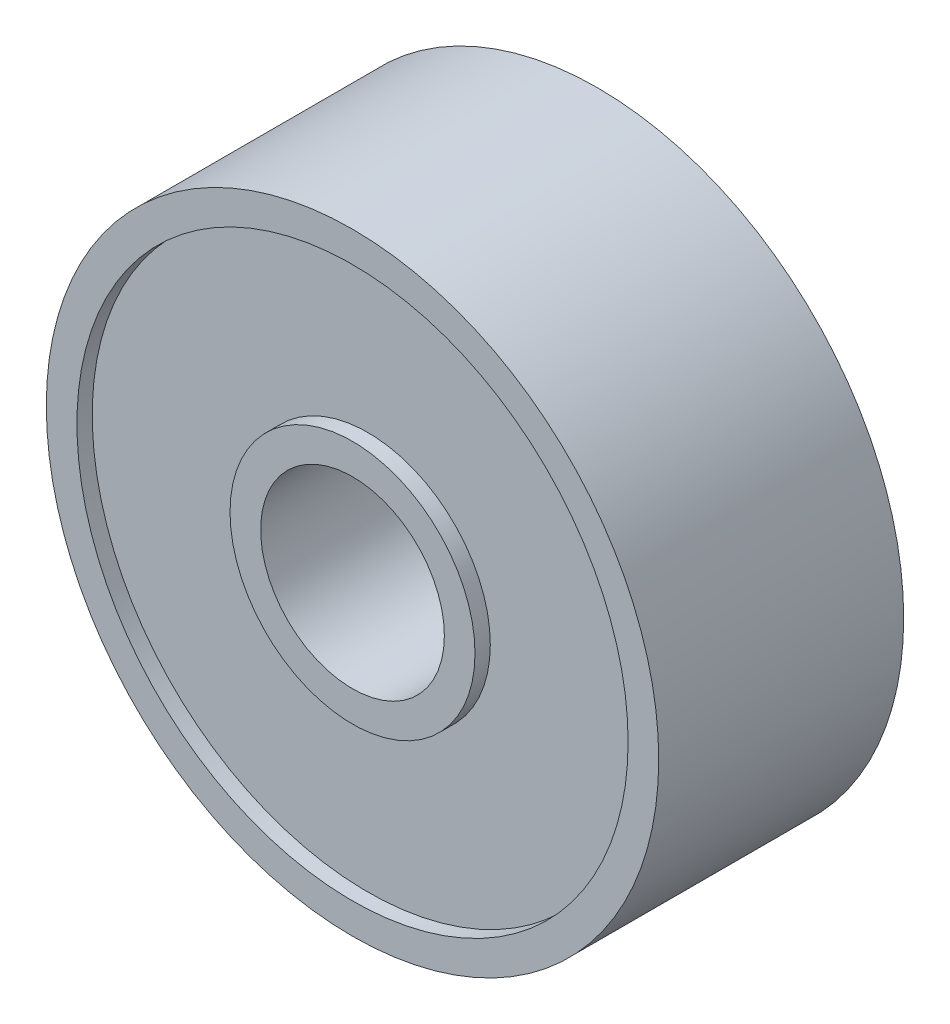
ISO-10303-21;
HEADER;
FILE_DESCRIPTION(('STEP AP214'),'2;1');
FILE_NAME('part.step','',(''),(''),'','','');
FILE_SCHEMA(('AUTOMOTIVE_DESIGN { 1 0 10303 214 1 1 1 1 }'));
ENDSEC;
DATA;
#1=APPLICATION_CONTEXT('core data for automotive mechanical design processes');
#2=APPLICATION_PROTOCOL_DEFINITION('international standard','automotive_design',2000,#1);
#3=PRODUCT_CONTEXT('',#1,'mechanical');
#4=PRODUCT('Part','Part','',(#3));
#5=PRODUCT_RELATED_PRODUCT_CATEGORY('part','',(#4));
#6=PRODUCT_DEFINITION_FORMATION('','',#4);
#7=PRODUCT_DEFINITION_CONTEXT('part definition',#1,'design');
#8=PRODUCT_DEFINITION('design','',#6,#7);
#9=PRODUCT_DEFINITION_SHAPE('','',#8);
#10=(LENGTH_UNIT() NAMED_UNIT(*) SI_UNIT(.MILLI.,.METRE.));
#11=(NAMED_UNIT(*) PLANE_ANGLE_UNIT() SI_UNIT($,.RADIAN.));
#12=(NAMED_UNIT(*) SI_UNIT($,.STERADIAN.) SOLID_ANGLE_UNIT());
#13=UNCERTAINTY_MEASURE_WITH_UNIT(LENGTH_MEASURE(1.E-05),#10,'distance_accuracy_value','');
#14=(GEOMETRIC_REPRESENTATION_CONTEXT(3) GLOBAL_UNCERTAINTY_ASSIGNED_CONTEXT((#13)) GLOBAL_UNIT_ASSIGNED_CONTEXT((#10,
#11,#12)) REPRESENTATION_CONTEXT('',''));
#15=CARTESIAN_POINT('',(0.,0.,0.));
#16=DIRECTION('',(0.,0.,1.));
#17=DIRECTION('',(1.,0.,0.));
#18=AXIS2_PLACEMENT_3D('',#15,#16,#17);
#19=CARTESIAN_POINT('',(0.,0.,-2.));
#20=DIRECTION('',(0.,0.,1.));
#21=DIRECTION('',(1.,0.,0.));
#22=AXIS2_PLACEMENT_3D('',#19,#20,#21);
#23=PLANE('',#22);
#24=CARTESIAN_POINT('',(0.,0.,-2.));
#25=DIRECTION('',(0.,0.,1.));
#26=DIRECTION('',(1.,0.,0.));
#27=AXIS2_PLACEMENT_3D('',#24,#25,#26);
#28=CIRCLE('',#27,1.5);
#29=CARTESIAN_POINT('',(1.5,0.,-2.));
#30=VERTEX_POINT('',#29);
#31=EDGE_CURVE('E60',#30,#30,#28,.T.);
#32=ORIENTED_EDGE('',*,*,#31,.T.);
#33=EDGE_LOOP('',(#32));
#34=FACE_BOUND('',#33,.T.);
#35=CARTESIAN_POINT('',(0.,0.,-2.));
#36=DIRECTION('',(0.,0.,1.));
#37=DIRECTION('',(1.,0.,0.));
#38=AXIS2_PLACEMENT_3D('',#35,#36,#37);
#39=CIRCLE('',#38,2.);
#40=CARTESIAN_POINT('',(2.,0.,-2.));
#41=VERTEX_POINT('',#40);
#42=EDGE_CURVE('E84',#41,#41,#39,.T.);
#43=ORIENTED_EDGE('',*,*,#42,.F.);
#44=EDGE_LOOP('',(#43));
#45=FACE_BOUND('',#44,.T.);
#46=ADVANCED_FACE('F47',(#34,#45),#23,.F.);
#47=CARTESIAN_POINT('',(0.,0.,2.));
#48=DIRECTION('',(0.,0.,1.));
#49=DIRECTION('',(1.,0.,0.));
#50=AXIS2_PLACEMENT_3D('',#47,#48,#49);
#51=PLANE('',#50);
#52=CARTESIAN_POINT('',(0.,0.,2.));
#53=DIRECTION('',(0.,0.,1.));
#54=DIRECTION('',(1.,0.,0.));
#55=AXIS2_PLACEMENT_3D('',#52,#53,#54);
#56=CIRCLE('',#55,1.5);
#57=CARTESIAN_POINT('',(1.5,0.,2.));
#58=VERTEX_POINT('',#57);
#59=EDGE_CURVE('E58',#58,#58,#56,.T.);
#60=ORIENTED_EDGE('',*,*,#59,.F.);
#61=EDGE_LOOP('',(#60));
#62=FACE_BOUND('',#61,.T.);
#63=CARTESIAN_POINT('',(0.,0.,2.));
#64=DIRECTION('',(0.,0.,1.));
#65=DIRECTION('',(1.,0.,0.));
#66=AXIS2_PLACEMENT_3D('',#63,#64,#65);
#67=CIRCLE('',#66,2.);
#68=CARTESIAN_POINT('',(2.,0.,2.));
#69=VERTEX_POINT('',#68);
#70=EDGE_CURVE('E72',#69,#69,#67,.T.);
#71=ORIENTED_EDGE('',*,*,#70,.T.);
#72=EDGE_LOOP('',(#71));
#73=FACE_BOUND('',#72,.T.);
#74=ADVANCED_FACE('F100',(#62,#73),#51,.T.);
#75=CARTESIAN_POINT('',(0.,0.,2.));
#76=DIRECTION('',(0.,0.,1.));
#77=DIRECTION('',(1.,0.,0.));
#78=AXIS2_PLACEMENT_3D('',#75,#76,#77);
#79=CIRCLE('',#78,4.5);
#80=CARTESIAN_POINT('',(4.5,0.,2.));
#81=VERTEX_POINT('',#80);
#82=EDGE_CURVE('E66',#81,#81,#79,.T.);
#83=ORIENTED_EDGE('',*,*,#82,.F.);
#84=EDGE_LOOP('',(#83));
#85=FACE_BOUND('',#84,.T.);
#86=CARTESIAN_POINT('',(0.,0.,2.));
#87=DIRECTION('',(0.,0.,1.));
#88=DIRECTION('',(1.,0.,0.));
#89=AXIS2_PLACEMENT_3D('',#86,#87,#88);
#90=CIRCLE('',#89,5.);
#91=CARTESIAN_POINT('',(5.,0.,2.));
#92=VERTEX_POINT('',#91);
#93=EDGE_CURVE('E11',#92,#92,#90,.T.);
#94=ORIENTED_EDGE('',*,*,#93,.T.);
#95=EDGE_LOOP('',(#94));
#96=FACE_BOUND('',#95,.T.);
#97=ADVANCED_FACE('F106',(#85,#96),#51,.T.);
#98=CARTESIAN_POINT('',(0.,0.,-2.));
#99=DIRECTION('',(0.,0.,1.));
#100=DIRECTION('',(1.,0.,0.));
#101=AXIS2_PLACEMENT_3D('',#98,#99,#100);
#102=CIRCLE('',#101,4.5);
#103=CARTESIAN_POINT('',(4.5,0.,-2.));
#104=VERTEX_POINT('',#103);
#105=EDGE_CURVE('E78',#104,#104,#102,.T.);
#106=ORIENTED_EDGE('',*,*,#105,.T.);
#107=EDGE_LOOP('',(#106));
#108=FACE_BOUND('',#107,.T.);
#109=CARTESIAN_POINT('',(0.,0.,-2.));
#110=DIRECTION('',(0.,0.,1.));
#111=DIRECTION('',(1.,0.,0.));
#112=AXIS2_PLACEMENT_3D('',#109,#110,#111);
#113=CIRCLE('',#112,5.);
#114=CARTESIAN_POINT('',(5.,0.,-2.));
#115=VERTEX_POINT('',#114);
#116=EDGE_CURVE('E51',#115,#115,#113,.T.);
#117=ORIENTED_EDGE('',*,*,#116,.F.);
#118=EDGE_LOOP('',(#117));
#119=FACE_BOUND('',#118,.T.);
#120=ADVANCED_FACE('F102',(#108,#119),#23,.F.);
#121=CARTESIAN_POINT('',(0.,0.,2.));
#122=DIRECTION('',(0.,0.,-1.));
#123=DIRECTION('',(-1.,0.,0.));
#124=AXIS2_PLACEMENT_3D('',#121,#122,#123);
#125=CYLINDRICAL_SURFACE('',#124,5.);
#126=ORIENTED_EDGE('',*,*,#93,.F.);
#127=EDGE_LOOP('',(#126));
#128=FACE_BOUND('',#127,.T.);
#129=ORIENTED_EDGE('',*,*,#116,.T.);
#130=EDGE_LOOP('',(#129));
#131=FACE_BOUND('',#130,.T.);
#132=ADVANCED_FACE('F49',(#128,#131),#125,.T.);
#133=CARTESIAN_POINT('',(0.,0.,2.));
#134=DIRECTION('',(0.,0.,-1.));
#135=DIRECTION('',(-1.,0.,0.));
#136=AXIS2_PLACEMENT_3D('',#133,#134,#135);
#137=CYLINDRICAL_SURFACE('',#136,1.5);
#138=ORIENTED_EDGE('',*,*,#59,.T.);
#139=EDGE_LOOP('',(#138));
#140=FACE_BOUND('',#139,.T.);
#141=ORIENTED_EDGE('',*,*,#31,.F.);
#142=EDGE_LOOP('',(#141));
#143=FACE_BOUND('',#142,.T.);
#144=ADVANCED_FACE('F115',(#140,#143),#137,.F.);
#145=CARTESIAN_POINT('',(0.,0.,1.75));
#146=DIRECTION('',(0.,0.,1.));
#147=DIRECTION('',(1.,0.,0.));
#148=AXIS2_PLACEMENT_3D('',#145,#146,#147);
#149=CYLINDRICAL_SURFACE('',#148,4.5);
#150=CARTESIAN_POINT('',(0.,0.,1.75));
#151=DIRECTION('',(0.,0.,1.));
#152=DIRECTION('',(1.,0.,0.));
#153=AXIS2_PLACEMENT_3D('',#150,#151,#152);
#154=CIRCLE('',#153,4.5);
#155=CARTESIAN_POINT('',(4.5,0.,1.75));
#156=VERTEX_POINT('',#155);
#157=EDGE_CURVE('E63',#156,#156,#154,.T.);
#158=ORIENTED_EDGE('',*,*,#157,.F.);
#159=EDGE_LOOP('',(#158));
#160=FACE_BOUND('',#159,.T.);
#161=ORIENTED_EDGE('',*,*,#82,.T.);
#162=EDGE_LOOP('',(#161));
#163=FACE_BOUND('',#162,.T.);
#164=ADVANCED_FACE('F139',(#160,#163),#149,.F.);
#165=CARTESIAN_POINT('',(0.,0.,1.75));
#166=DIRECTION('',(0.,0.,1.));
#167=DIRECTION('',(1.,0.,0.));
#168=AXIS2_PLACEMENT_3D('',#165,#166,#167);
#169=PLANE('',#168);
#170=CARTESIAN_POINT('',(0.,0.,1.75));
#171=DIRECTION('',(0.,0.,1.));
#172=DIRECTION('',(1.,0.,0.));
#173=AXIS2_PLACEMENT_3D('',#170,#171,#172);
#174=CIRCLE('',#173,2.);
#175=CARTESIAN_POINT('',(2.,0.,1.75));
#176=VERTEX_POINT('',#175);
#177=EDGE_CURVE('E69',#176,#176,#174,.T.);
#178=ORIENTED_EDGE('',*,*,#177,.F.);
#179=EDGE_LOOP('',(#178));
#180=FACE_BOUND('',#179,.T.);
#181=ORIENTED_EDGE('',*,*,#157,.T.);
#182=EDGE_LOOP('',(#181));
#183=FACE_BOUND('',#182,.T.);
#184=ADVANCED_FACE('F135',(#180,#183),#169,.T.);
#185=CARTESIAN_POINT('',(0.,0.,1.75));
#186=DIRECTION('',(0.,0.,1.));
#187=DIRECTION('',(1.,0.,0.));
#188=AXIS2_PLACEMENT_3D('',#185,#186,#187);
#189=CYLINDRICAL_SURFACE('',#188,2.);
#190=ORIENTED_EDGE('',*,*,#177,.T.);
#191=EDGE_LOOP('',(#190));
#192=FACE_BOUND('',#191,.T.);
#193=ORIENTED_EDGE('',*,*,#70,.F.);
#194=EDGE_LOOP('',(#193));
#195=FACE_BOUND('',#194,.T.);
#196=ADVANCED_FACE('F129',(#192,#195),#189,.T.);
#197=CARTESIAN_POINT('',(0.,0.,-1.75));
#198=DIRECTION('',(0.,0.,-1.));
#199=DIRECTION('',(1.,0.,0.));
#200=AXIS2_PLACEMENT_3D('',#197,#198,#199);
#201=PLANE('',#200);
#202=CARTESIAN_POINT('',(0.,0.,-1.75));
#203=DIRECTION('',(0.,0.,1.));
#204=DIRECTION('',(1.,0.,0.));
#205=AXIS2_PLACEMENT_3D('',#202,#203,#204);
#206=CIRCLE('',#205,4.5);
#207=CARTESIAN_POINT('',(4.5,0.,-1.75));
#208=VERTEX_POINT('',#207);
#209=EDGE_CURVE('E75',#208,#208,#206,.T.);
#210=ORIENTED_EDGE('',*,*,#209,.F.);
#211=EDGE_LOOP('',(#210));
#212=FACE_BOUND('',#211,.T.);
#213=CARTESIAN_POINT('',(0.,0.,-1.75));
#214=DIRECTION('',(0.,0.,1.));
#215=DIRECTION('',(1.,0.,0.));
#216=AXIS2_PLACEMENT_3D('',#213,#214,#215);
#217=CIRCLE('',#216,2.);
#218=CARTESIAN_POINT('',(2.,0.,-1.75));
#219=VERTEX_POINT('',#218);
#220=EDGE_CURVE('E81',#219,#219,#217,.T.);
#221=ORIENTED_EDGE('',*,*,#220,.T.);
#222=EDGE_LOOP('',(#221));
#223=FACE_BOUND('',#222,.T.);
#224=ADVANCED_FACE('F90',(#212,#223),#201,.T.);
#225=CARTESIAN_POINT('',(0.,0.,-1.75));
#226=DIRECTION('',(0.,0.,-1.));
#227=DIRECTION('',(-1.,0.,0.));
#228=AXIS2_PLACEMENT_3D('',#225,#226,#227);
#229=CYLINDRICAL_SURFACE('',#228,4.5);
#230=ORIENTED_EDGE('',*,*,#209,.T.);
#231=EDGE_LOOP('',(#230));
#232=FACE_BOUND('',#231,.T.);
#233=ORIENTED_EDGE('',*,*,#105,.F.);
#234=EDGE_LOOP('',(#233));
#235=FACE_BOUND('',#234,.T.);
#236=ADVANCED_FACE('F95',(#232,#235),#229,.F.);
#237=CARTESIAN_POINT('',(0.,0.,-1.75));
#238=DIRECTION('',(0.,0.,-1.));
#239=DIRECTION('',(-1.,0.,0.));
#240=AXIS2_PLACEMENT_3D('',#237,#238,#239);
#241=CYLINDRICAL_SURFACE('',#240,2.);
#242=ORIENTED_EDGE('',*,*,#220,.F.);
#243=EDGE_LOOP('',(#242));
#244=FACE_BOUND('',#243,.T.);
#245=ORIENTED_EDGE('',*,*,#42,.T.);
#246=EDGE_LOOP('',(#245));
#247=FACE_BOUND('',#246,.T.);
#248=ADVANCED_FACE('F92',(#244,#247),#241,.T.);
#249=CLOSED_SHELL('',(#46,#74,#97,#120,#132,#144,#164,#184,#196,#224,#236,#248));
#250=MANIFOLD_SOLID_BREP('B2',#249);
#251=ADVANCED_BREP_SHAPE_REPRESENTATION('',(#18,#250),#14);
#252=SHAPE_DEFINITION_REPRESENTATION(#9,#251);
ENDSEC;
END-ISO-10303-21;
